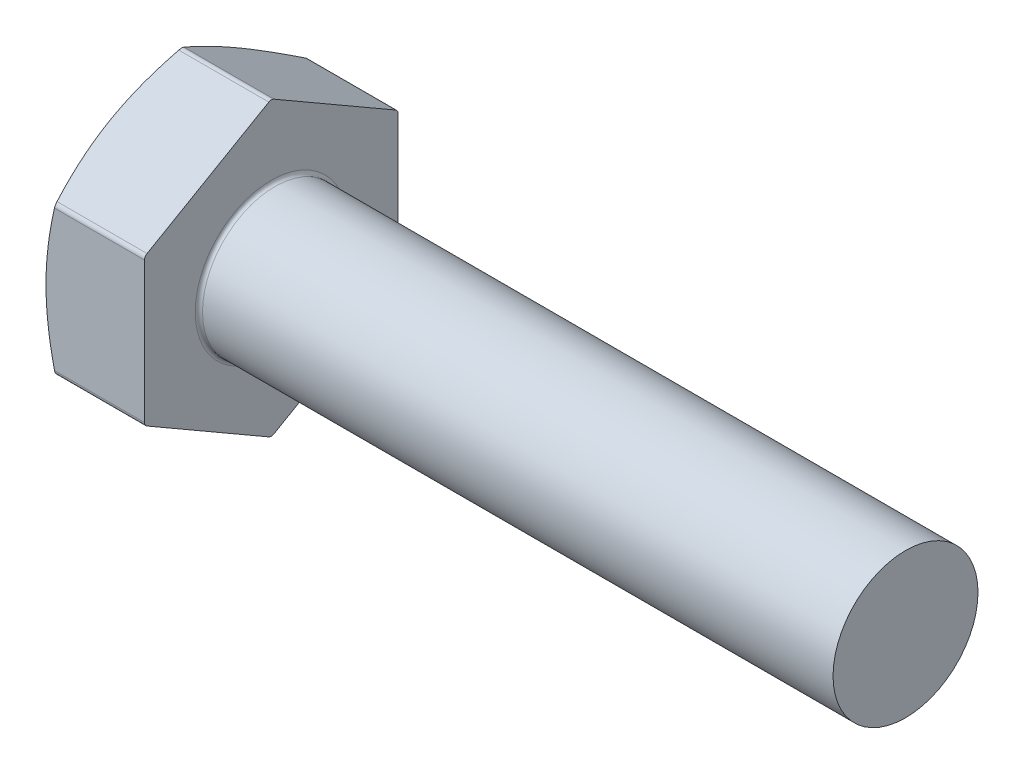
ISO-10303-21;
HEADER;
FILE_DESCRIPTION(('STEP AP214'),'2;1');
FILE_NAME('part.step','',(''),(''),'','','');
FILE_SCHEMA(('AUTOMOTIVE_DESIGN { 1 0 10303 214 1 1 1 1 }'));
ENDSEC;
DATA;
#1=APPLICATION_CONTEXT('core data for automotive mechanical design processes');
#2=APPLICATION_PROTOCOL_DEFINITION('international standard','automotive_design',2000,#1);
#3=PRODUCT_CONTEXT('',#1,'mechanical');
#4=PRODUCT('Part','Part','',(#3));
#5=PRODUCT_RELATED_PRODUCT_CATEGORY('part','',(#4));
#6=PRODUCT_DEFINITION_FORMATION('','',#4);
#7=PRODUCT_DEFINITION_CONTEXT('part definition',#1,'design');
#8=PRODUCT_DEFINITION('design','',#6,#7);
#9=PRODUCT_DEFINITION_SHAPE('','',#8);
#10=(LENGTH_UNIT() NAMED_UNIT(*) SI_UNIT(.MILLI.,.METRE.));
#11=(NAMED_UNIT(*) PLANE_ANGLE_UNIT() SI_UNIT($,.RADIAN.));
#12=(NAMED_UNIT(*) SI_UNIT($,.STERADIAN.) SOLID_ANGLE_UNIT());
#13=UNCERTAINTY_MEASURE_WITH_UNIT(LENGTH_MEASURE(1.E-05),#10,'distance_accuracy_value','');
#14=(GEOMETRIC_REPRESENTATION_CONTEXT(3) GLOBAL_UNCERTAINTY_ASSIGNED_CONTEXT((#13)) GLOBAL_UNIT_ASSIGNED_CONTEXT((#10,
#11,#12)) REPRESENTATION_CONTEXT('',''));
#15=CARTESIAN_POINT('',(0.,0.,0.));
#16=DIRECTION('',(0.,0.,1.));
#17=DIRECTION('',(1.,0.,0.));
#18=AXIS2_PLACEMENT_3D('',#15,#16,#17);
#19=CARTESIAN_POINT('',(60.,0.,0.));
#20=DIRECTION('',(-1.,0.,0.));
#21=DIRECTION('',(0.,0.,1.));
#22=AXIS2_PLACEMENT_3D('',#19,#20,#21);
#23=CYLINDRICAL_SURFACE('',#22,2.);
#24=CARTESIAN_POINT('',(0.100000000000003,0.,0.));
#25=DIRECTION('',(-1.,0.,0.));
#26=DIRECTION('',(0.,0.,1.));
#27=AXIS2_PLACEMENT_3D('',#24,#25,#26);
#28=CIRCLE('',#27,2.);
#29=CARTESIAN_POINT('',(0.100000000000003,0.,2.));
#30=VERTEX_POINT('',#29);
#31=EDGE_CURVE('E12',#30,#30,#28,.F.);
#32=ORIENTED_EDGE('',*,*,#31,.T.);
#33=EDGE_LOOP('',(#32));
#34=FACE_BOUND('',#33,.T.);
#35=CARTESIAN_POINT('',(17.5,0.,0.));
#36=DIRECTION('',(1.,0.,0.));
#37=DIRECTION('',(0.,0.,-1.));
#38=AXIS2_PLACEMENT_3D('',#35,#36,#37);
#39=CIRCLE('',#38,2.);
#40=CARTESIAN_POINT('',(17.5,0.,-2.));
#41=VERTEX_POINT('',#40);
#42=EDGE_CURVE('E309',#41,#41,#39,.T.);
#43=ORIENTED_EDGE('',*,*,#42,.F.);
#44=EDGE_LOOP('',(#43));
#45=FACE_BOUND('',#44,.T.);
#46=ADVANCED_FACE('F40',(#34,#45),#23,.T.);
#47=CARTESIAN_POINT('',(-2.8,2.02072594216369,3.5));
#48=DIRECTION('',(0.,-0.866025403784439,-0.5));
#49=DIRECTION('',(0.,0.5,-0.866025403784439));
#50=AXIS2_PLACEMENT_3D('',#47,#48,#49);
#51=PLANE('',#50);
#52=DIRECTION('',(0.,0.5,-0.866025403784439));
#53=VECTOR('',#52,1.);
#54=CARTESIAN_POINT('',(0.,2.02072594216369,3.5));
#55=LINE('',#54,#53);
#56=CARTESIAN_POINT('',(0.,2.06114046100696,3.43));
#57=VERTEX_POINT('',#56);
#58=CARTESIAN_POINT('',(0.,4.00103736548411,0.0700000000000015));
#59=VERTEX_POINT('',#58);
#60=EDGE_CURVE('E258',#57,#59,#55,.T.);
#61=ORIENTED_EDGE('',*,*,#60,.T.);
#62=DIRECTION('',(1.,0.,0.));
#63=VECTOR('',#62,1.);
#64=CARTESIAN_POINT('',(-2.8,4.00103736548411,0.0699999999999998));
#65=LINE('',#64,#63);
#66=CARTESIAN_POINT('',(-2.48447308173447,4.00103736548378,0.0700000000005721));
#67=VERTEX_POINT('',#66);
#68=EDGE_CURVE('E286',#59,#67,#65,.F.);
#69=ORIENTED_EDGE('',*,*,#68,.T.);
#70=CARTESIAN_POINT('',(-2.46585915276062,2.02061047210985,3.5002));
#71=CARTESIAN_POINT('',(-2.49435720330421,2.08172237683272,3.39435107607269));
#72=CARTESIAN_POINT('',(-2.52102527978907,2.14305977702696,3.28811158253207));
#73=CARTESIAN_POINT('',(-2.57006624025615,2.26619488647482,3.07483531677283));
#74=CARTESIAN_POINT('',(-2.59243680031113,2.32799282611283,2.96779814551672));
#75=CARTESIAN_POINT('',(-2.63223398193864,2.45205045894466,2.75292402238527));
#76=CARTESIAN_POINT('',(-2.64965595197225,2.51431053050519,2.64508641515955));
#77=CARTESIAN_POINT('',(-2.67891284459737,2.63914989249766,2.42885829740411));
#78=CARTESIAN_POINT('',(-2.69074881404304,2.70172912089366,2.32046789432379));
#79=CARTESIAN_POINT('',(-2.70817985225303,2.82580298290105,2.1055656614357));
#80=CARTESIAN_POINT('',(-2.7138992432372,2.88729319870679,1.99906148349178));
#81=CARTESIAN_POINT('',(-2.71928805385423,3.01034457988701,1.78593023934611));
#82=CARTESIAN_POINT('',(-2.71895711322359,3.07190574926814,1.67930316620464));
#83=CARTESIAN_POINT('',(-2.71226194731382,3.19488718090371,1.46629307822427));
#84=CARTESIAN_POINT('',(-2.70590334546463,3.25630752101061,1.35990992854096));
#85=CARTESIAN_POINT('',(-2.68742663821943,3.37892378186288,1.14753233491071));
#86=CARTESIAN_POINT('',(-2.67530905672399,3.4401197225119,1.04153785648963));
#87=CARTESIAN_POINT('',(-2.64959234504912,3.54642377302546,0.857413839949795));
#88=CARTESIAN_POINT('',(-2.63718382478458,3.59160553859148,0.779156726413772));
#89=CARTESIAN_POINT('',(-2.60968662380015,3.6817624957083,0.623000296031627));
#90=CARTESIAN_POINT('',(-2.59459805438181,3.72673769575816,0.54510096446471));
#91=CARTESIAN_POINT('',(-2.56185590357441,3.81682907176803,0.389058123891816));
#92=CARTESIAN_POINT('',(-2.54418251998616,3.86194343486688,0.310917754853488));
#93=CARTESIAN_POINT('',(-2.50661976341031,3.95193357178633,0.155050265528923));
#94=CARTESIAN_POINT('',(-2.4867307618899,3.99680938428408,0.0773230782518859));
#95=CARTESIAN_POINT('',(-2.46585915276062,4.04156735438122,-0.000200000000000179));
#96=B_SPLINE_CURVE_WITH_KNOTS('',3,(#70,#71,#72,#73,#74,#75,#76,#77,#78,#79,#80,#81,#82,#83,#84,
#85,#86,#87,#88,#89,#90,#91,#92,#93,#94,#95),.UNSPECIFIED.,.F.,.F.,(4,2,2,2,2,2,2,2,2,2,2,2,4),
(0.,0.376527941460667,0.753258924731065,1.13034286170485,1.50735610251863,1.87655158670366,
2.24576905449206,2.61464240418558,2.98348220349541,3.25707668499803,3.53065980686928,
3.80646078693032,4.08221559600711),.UNSPECIFIED.);
#97=CARTESIAN_POINT('',(-2.48447308173432,2.06114046100696,3.43));
#98=VERTEX_POINT('',#97);
#99=EDGE_CURVE('E250',#98,#67,#96,.T.);
#100=ORIENTED_EDGE('',*,*,#99,.F.);
#101=DIRECTION('',(1.,0.,0.));
#102=VECTOR('',#101,1.);
#103=CARTESIAN_POINT('',(-2.8,2.06114046100696,3.43));
#104=LINE('',#103,#102);
#105=EDGE_CURVE('E289',#98,#57,#104,.T.);
#106=ORIENTED_EDGE('',*,*,#105,.T.);
#107=EDGE_LOOP('',(#61,#69,#100,#106));
#108=FACE_BOUND('',#107,.T.);
#109=ADVANCED_FACE('F240',(#108),#51,.F.);
#110=CARTESIAN_POINT('',(-2.8,4.04145188432738,0.));
#111=DIRECTION('',(0.,-0.866025403784439,0.5));
#112=DIRECTION('',(0.,-0.5,-0.866025403784439));
#113=AXIS2_PLACEMENT_3D('',#110,#111,#112);
#114=PLANE('',#113);
#115=DIRECTION('',(0.,-0.5,-0.866025403784439));
#116=VECTOR('',#115,1.);
#117=CARTESIAN_POINT('',(0.,4.04145188432738,0.));
#118=LINE('',#117,#116);
#119=CARTESIAN_POINT('',(0.,4.00103736548411,-0.0700000000000001));
#120=VERTEX_POINT('',#119);
#121=CARTESIAN_POINT('',(0.,2.06114046100696,-3.43));
#122=VERTEX_POINT('',#121);
#123=EDGE_CURVE('E267',#120,#122,#118,.T.);
#124=ORIENTED_EDGE('',*,*,#123,.T.);
#125=DIRECTION('',(1.,0.,0.));
#126=VECTOR('',#125,1.);
#127=CARTESIAN_POINT('',(-2.8,2.06114046100696,-3.43));
#128=LINE('',#127,#126);
#129=CARTESIAN_POINT('',(-2.48447308173447,2.06114046100729,-3.42999999999943));
#130=VERTEX_POINT('',#129);
#131=EDGE_CURVE('E360',#122,#130,#128,.F.);
#132=ORIENTED_EDGE('',*,*,#131,.T.);
#133=CARTESIAN_POINT('',(-2.46585915276062,4.04156735438122,0.000199999999999946));
#134=CARTESIAN_POINT('',(-2.49435720330421,3.98045544965835,-0.105648923927311));
#135=CARTESIAN_POINT('',(-2.52102527978907,3.91911804946411,-0.21188841746793));
#136=CARTESIAN_POINT('',(-2.57006624025615,3.79598294001625,-0.425164683227171));
#137=CARTESIAN_POINT('',(-2.59243680031113,3.73418500037824,-0.532201854483278));
#138=CARTESIAN_POINT('',(-2.63223398193864,3.61012736754641,-0.747075977614734));
#139=CARTESIAN_POINT('',(-2.64965595197225,3.54786729598588,-0.854913584840449));
#140=CARTESIAN_POINT('',(-2.67891284459737,3.42302793399341,-1.07114170259589));
#141=CARTESIAN_POINT('',(-2.69074881404304,3.36044870559741,-1.17953210567621));
#142=CARTESIAN_POINT('',(-2.70817985225303,3.23637484359003,-1.3944343385643));
#143=CARTESIAN_POINT('',(-2.7138992432372,3.17488462778428,-1.50093851650822));
#144=CARTESIAN_POINT('',(-2.71928805385423,3.05183324660406,-1.71406976065389));
#145=CARTESIAN_POINT('',(-2.71895711322359,2.99027207722293,-1.82069683379536));
#146=CARTESIAN_POINT('',(-2.71226194731382,2.86729064558736,-2.03370692177573));
#147=CARTESIAN_POINT('',(-2.70590334546463,2.80587030548046,-2.14009007145904));
#148=CARTESIAN_POINT('',(-2.68742663821944,2.68325404462819,-2.35246766508929));
#149=CARTESIAN_POINT('',(-2.67530905672399,2.62205810397917,-2.45846214351036));
#150=CARTESIAN_POINT('',(-2.64959234504912,2.51575405346561,-2.6425861600502));
#151=CARTESIAN_POINT('',(-2.63718382478458,2.47057228789959,-2.72084327358623));
#152=CARTESIAN_POINT('',(-2.60968662380015,2.38041533078277,-2.87699970396837));
#153=CARTESIAN_POINT('',(-2.59459805438181,2.33544013073292,-2.95489903553529));
#154=CARTESIAN_POINT('',(-2.56185590357441,2.24534875472304,-3.11094187610818));
#155=CARTESIAN_POINT('',(-2.54418251998616,2.20023439162419,-3.18908224514651));
#156=CARTESIAN_POINT('',(-2.50661976341031,2.11024425470474,-3.34494973447108));
#157=CARTESIAN_POINT('',(-2.4867307618899,2.06536844220699,-3.42267692174811));
#158=CARTESIAN_POINT('',(-2.46585915276062,2.02061047210985,-3.5002));
#159=B_SPLINE_CURVE_WITH_KNOTS('',3,(#133,#134,#135,#136,#137,#138,#139,#140,#141,#142,#143,
#144,#145,#146,#147,#148,#149,#150,#151,#152,#153,#154,#155,#156,#157,#158),.UNSPECIFIED.,.F.,
.F.,(4,2,2,2,2,2,2,2,2,2,2,2,4),(0.,0.376527941460667,0.753258924731066,1.13034286170485,
1.50735610251863,1.87655158670366,2.24576905449206,2.61464240418558,2.98348220349541,
3.25707668499803,3.53065980686928,3.80646078693033,4.08221559600712),.UNSPECIFIED.);
#160=CARTESIAN_POINT('',(-2.48447308173432,4.00103736548411,-0.0700000000000002));
#161=VERTEX_POINT('',#160);
#162=EDGE_CURVE('E259',#161,#130,#159,.T.);
#163=ORIENTED_EDGE('',*,*,#162,.F.);
#164=DIRECTION('',(1.,0.,0.));
#165=VECTOR('',#164,1.);
#166=CARTESIAN_POINT('',(-2.8,4.00103736548411,-0.0700000000000001));
#167=LINE('',#166,#165);
#168=EDGE_CURVE('E365',#161,#120,#167,.T.);
#169=ORIENTED_EDGE('',*,*,#168,.T.);
#170=EDGE_LOOP('',(#124,#132,#163,#169));
#171=FACE_BOUND('',#170,.T.);
#172=ADVANCED_FACE('F245',(#171),#114,.F.);
#173=CARTESIAN_POINT('',(-2.8,2.02072594216369,-3.5));
#174=DIRECTION('',(0.,0.,1.));
#175=DIRECTION('',(0.,-1.,0.));
#176=AXIS2_PLACEMENT_3D('',#173,#174,#175);
#177=PLANE('',#176);
#178=DIRECTION('',(0.,-1.,0.));
#179=VECTOR('',#178,1.);
#180=CARTESIAN_POINT('',(0.,2.02072594216369,-3.5));
#181=LINE('',#180,#179);
#182=CARTESIAN_POINT('',(0.,1.93989690447714,-3.5));
#183=VERTEX_POINT('',#182);
#184=CARTESIAN_POINT('',(0.,-1.93989690447714,-3.5));
#185=VERTEX_POINT('',#184);
#186=EDGE_CURVE('E270',#183,#185,#181,.T.);
#187=ORIENTED_EDGE('',*,*,#186,.T.);
#188=DIRECTION('',(1.,0.,0.));
#189=VECTOR('',#188,1.);
#190=CARTESIAN_POINT('',(-2.8,-1.93989690447714,-3.5));
#191=LINE('',#190,#189);
#192=CARTESIAN_POINT('',(-2.48447308173432,-1.93989690447714,-3.5));
#193=VERTEX_POINT('',#192);
#194=EDGE_CURVE('E364',#185,#193,#191,.F.);
#195=ORIENTED_EDGE('',*,*,#194,.T.);
#196=CARTESIAN_POINT('',(-1.32100633349475,-5.47332337813791,-3.5));
#197=CARTESIAN_POINT('',(-1.38336525145743,-5.31454546120619,-3.5));
#198=CARTESIAN_POINT('',(-1.44507234656034,-5.1555069251168,-3.5));
#199=CARTESIAN_POINT('',(-1.5668111673363,-4.83677523361074,-3.5));
#200=CARTESIAN_POINT('',(-1.62684275073955,-4.67708202391734,-3.5));
#201=CARTESIAN_POINT('',(-1.74502799389888,-4.35644650093455,-3.5));
#202=CARTESIAN_POINT('',(-1.80317537146743,-4.19550186390653,-3.5));
#203=CARTESIAN_POINT('',(-1.91687564710078,-3.87269502020751,-3.5));
#204=CARTESIAN_POINT('',(-1.97242853941524,-3.71083281150372,-3.5));
#205=CARTESIAN_POINT('',(-2.07941866422775,-3.38856078400984,-3.5));
#206=CARTESIAN_POINT('',(-2.13090673408788,-3.22816792990599,-3.5));
#207=CARTESIAN_POINT('',(-2.22987237828365,-2.90615249132493,-3.5));
#208=CARTESIAN_POINT('',(-2.27735018156085,-2.74452997762259,-3.5));
#209=CARTESIAN_POINT('',(-2.36718655860079,-2.42001829020189,-3.5));
#210=CARTESIAN_POINT('',(-2.40954999256595,-2.25713047813531,-3.5));
#211=CARTESIAN_POINT('',(-2.48790915336851,-1.92977581610914,-3.5));
#212=CARTESIAN_POINT('',(-2.52390299469217,-1.7653085137308,-3.5));
#213=CARTESIAN_POINT('',(-2.5998124160193,-1.37369049681621,-3.5));
#214=CARTESIAN_POINT('',(-2.63626315550615,-1.14583217939736,-3.5));
#215=CARTESIAN_POINT('',(-2.67684855043411,-0.80245170627022,-3.5));
#216=CARTESIAN_POINT('',(-2.68802793449828,-0.6877435918983,-3.5));
#217=CARTESIAN_POINT('',(-2.70533306868503,-0.457951592195634,-3.5));
#218=CARTESIAN_POINT('',(-2.71145941952129,-0.34286775316528,-3.5));
#219=CARTESIAN_POINT('',(-2.71845360465395,-0.11183643850944,-3.5));
#220=CARTESIAN_POINT('',(-2.71928912033619,0.00411202164055741,-3.5));
#221=CARTESIAN_POINT('',(-2.71558474511865,0.235918939238521,-3.5));
#222=CARTESIAN_POINT('',(-2.71104499290419,0.351777398931383,-3.5));
#223=CARTESIAN_POINT('',(-2.69675940446445,0.583194078653194,-3.5));
#224=CARTESIAN_POINT('',(-2.68701250411305,0.698752232459826,-3.5));
#225=CARTESIAN_POINT('',(-2.66265524084536,0.92933205697672,-3.5));
#226=CARTESIAN_POINT('',(-2.64804540691725,1.04435378465985,-3.5));
#227=CARTESIAN_POINT('',(-2.57287454619112,1.55717230002804,-3.5));
#228=CARTESIAN_POINT('',(-2.48796806886785,1.95146038373873,-3.5));
#229=CARTESIAN_POINT('',(-2.33633314517701,2.53633288984111,-3.5));
#230=CARTESIAN_POINT('',(-2.28166216486293,2.73042578551327,-3.5));
#231=CARTESIAN_POINT('',(-2.16616302036065,3.11678273817431,-3.5));
#232=CARTESIAN_POINT('',(-2.10533572123528,3.30904704796718,-3.5));
#233=CARTESIAN_POINT('',(-1.97850555951288,3.69366513948681,-3.5));
#234=CARTESIAN_POINT('',(-1.91246273002805,3.88600550519339,-3.5));
#235=CARTESIAN_POINT('',(-1.77679346480294,4.26942072425074,-3.5));
#236=CARTESIAN_POINT('',(-1.70716695093892,4.46049554991036,-3.5));
#237=CARTESIAN_POINT('',(-1.56523403364987,4.8414256275756,-3.5));
#238=CARTESIAN_POINT('',(-1.49293036872617,5.03128190480489,-3.5));
#239=CARTESIAN_POINT('',(-1.34617754735182,5.41016485264392,-3.5));
#240=CARTESIAN_POINT('',(-1.27172835662194,5.59919150994308,-3.5));
#241=CARTESIAN_POINT('',(-1.04624323515366,6.16431801981198,-3.5));
#242=CARTESIAN_POINT('',(-0.892708182703138,6.53941954049077,-3.5));
#243=CARTESIAN_POINT('',(-0.581290168373941,7.28792347113465,-3.5));
#244=CARTESIAN_POINT('',(-0.423406007967022,7.66132537900782,-3.5));
#245=CARTESIAN_POINT('',(-0.107537463651079,8.40019296430014,-3.5));
#246=CARTESIAN_POINT('',(0.0503945439909416,8.76568106363534,-3.5));
#247=CARTESIAN_POINT('',(0.288789637834115,9.31318654656532,-3.5));
#248=CARTESIAN_POINT('',(0.368490668223535,9.49553669123051,-3.5));
#249=CARTESIAN_POINT('',(0.528331580760165,9.86004375061248,-3.5));
#250=CARTESIAN_POINT('',(0.608471461249065,10.0422006660563,-3.5));
#251=CARTESIAN_POINT('',(0.688796702796817,10.2242758614,-3.5));
#252=B_SPLINE_CURVE_WITH_KNOTS('',3,(#196,#197,#198,#199,#200,#201,#202,#203,#204,#205,#206,
#207,#208,#209,#210,#211,#212,#213,#214,#215,#216,#217,#218,#219,#220,#221,#222,#223,#224,#225,
#226,#227,#228,#229,#230,#231,#232,#233,#234,#235,#236,#237,#238,#239,#240,#241,#242,#243,#244,
#245,#246,#247,#248,#249,#250,#251),.UNSPECIFIED.,.F.,.F.,(4,2,2,2,2,2,2,2,2,2,2,2,2,2,2,2,2,2,
2,2,2,2,2,2,2,2,2,4),(0.,0.511758406715346,1.02356013608727,1.53692196590774,2.05028493347519,
2.55560654588075,3.0608992905247,3.56570800954206,4.07066591194245,4.76219851808089,
5.10785983858493,5.45348006032384,5.80120945335057,6.14892987493316,6.49672138341181,
6.84447507161213,8.05145689765206,8.65639956225731,9.26125734029584,9.87131042615079,
10.481376816704,11.090835524704,11.7003039754791,12.9161775628887,14.1323896410142,
15.3268326641363,15.9238536225229,16.5208723264662),.UNSPECIFIED.);
#253=CARTESIAN_POINT('',(-2.48447308173459,1.93989690447595,-3.5));
#254=VERTEX_POINT('',#253);
#255=EDGE_CURVE('E342',#254,#193,#252,.F.);
#256=ORIENTED_EDGE('',*,*,#255,.F.);
#257=DIRECTION('',(1.,0.,0.));
#258=VECTOR('',#257,1.);
#259=CARTESIAN_POINT('',(-2.8,1.93989690447714,-3.5));
#260=LINE('',#259,#258);
#261=EDGE_CURVE('E139',#254,#183,#260,.T.);
#262=ORIENTED_EDGE('',*,*,#261,.T.);
#263=EDGE_LOOP('',(#187,#195,#256,#262));
#264=FACE_BOUND('',#263,.T.);
#265=ADVANCED_FACE('F335',(#264),#177,.F.);
#266=CARTESIAN_POINT('',(-2.8,-2.02072594216369,-3.5));
#267=DIRECTION('',(0.,0.866025403784439,0.5));
#268=DIRECTION('',(0.,-0.5,0.866025403784439));
#269=AXIS2_PLACEMENT_3D('',#266,#267,#268);
#270=PLANE('',#269);
#271=DIRECTION('',(0.,-0.5,0.866025403784439));
#272=VECTOR('',#271,1.);
#273=CARTESIAN_POINT('',(0.,-2.02072594216369,-3.5));
#274=LINE('',#273,#272);
#275=CARTESIAN_POINT('',(0.,-2.06114046100696,-3.43));
#276=VERTEX_POINT('',#275);
#277=CARTESIAN_POINT('',(0.,-4.00103736548411,-0.0700000000000002));
#278=VERTEX_POINT('',#277);
#279=EDGE_CURVE('E273',#276,#278,#274,.T.);
#280=ORIENTED_EDGE('',*,*,#279,.T.);
#281=DIRECTION('',(1.,0.,0.));
#282=VECTOR('',#281,1.);
#283=CARTESIAN_POINT('',(-2.8,-4.00103736548411,-0.0699999999999998));
#284=LINE('',#283,#282);
#285=CARTESIAN_POINT('',(-2.48447308173447,-4.00103736548378,-0.0700000000005702));
#286=VERTEX_POINT('',#285);
#287=EDGE_CURVE('E173',#278,#286,#284,.F.);
#288=ORIENTED_EDGE('',*,*,#287,.T.);
#289=CARTESIAN_POINT('',(-2.46585915276062,-2.02061047210985,-3.5002));
#290=CARTESIAN_POINT('',(-2.49435720330421,-2.08172237683272,-3.39435107607269));
#291=CARTESIAN_POINT('',(-2.52102527978907,-2.14305977702696,-3.28811158253207));
#292=CARTESIAN_POINT('',(-2.57006624025615,-2.26619488647482,-3.07483531677283));
#293=CARTESIAN_POINT('',(-2.59243680031113,-2.32799282611283,-2.96779814551672));
#294=CARTESIAN_POINT('',(-2.63223398193864,-2.45205045894466,-2.75292402238526));
#295=CARTESIAN_POINT('',(-2.64965595197225,-2.51431053050519,-2.64508641515955));
#296=CARTESIAN_POINT('',(-2.67891284459737,-2.63914989249766,-2.42885829740411));
#297=CARTESIAN_POINT('',(-2.69074881404304,-2.70172912089366,-2.32046789432379));
#298=CARTESIAN_POINT('',(-2.70817985225303,-2.82580298290105,-2.1055656614357));
#299=CARTESIAN_POINT('',(-2.7138992432372,-2.88729319870679,-1.99906148349178));
#300=CARTESIAN_POINT('',(-2.71928805385423,-3.01034457988701,-1.78593023934611));
#301=CARTESIAN_POINT('',(-2.71895711322359,-3.07190574926814,-1.67930316620464));
#302=CARTESIAN_POINT('',(-2.71226194731382,-3.19488718090371,-1.46629307822427));
#303=CARTESIAN_POINT('',(-2.70590334546463,-3.25630752101061,-1.35990992854096));
#304=CARTESIAN_POINT('',(-2.68742663821944,-3.37892378186288,-1.14753233491071));
#305=CARTESIAN_POINT('',(-2.67530905672399,-3.4401197225119,-1.04153785648963));
#306=CARTESIAN_POINT('',(-2.64959234504912,-3.54642377302546,-0.857413839949794));
#307=CARTESIAN_POINT('',(-2.63718382478458,-3.59160553859148,-0.779156726413771));
#308=CARTESIAN_POINT('',(-2.60968662380015,-3.6817624957083,-0.623000296031626));
#309=CARTESIAN_POINT('',(-2.59459805438181,-3.72673769575816,-0.545100964464709));
#310=CARTESIAN_POINT('',(-2.56185590357441,-3.81682907176803,-0.389058123891815));
#311=CARTESIAN_POINT('',(-2.54418251998616,-3.86194343486688,-0.310917754853488));
#312=CARTESIAN_POINT('',(-2.50661976341031,-3.95193357178633,-0.155050265528922));
#313=CARTESIAN_POINT('',(-2.4867307618899,-3.99680938428408,-0.0773230782518856));
#314=CARTESIAN_POINT('',(-2.46585915276062,-4.04156735438122,0.000200000000000553));
#315=B_SPLINE_CURVE_WITH_KNOTS('',3,(#289,#290,#291,#292,#293,#294,#295,#296,#297,#298,#299,
#300,#301,#302,#303,#304,#305,#306,#307,#308,#309,#310,#311,#312,#313,#314),.UNSPECIFIED.,.F.,
.F.,(4,2,2,2,2,2,2,2,2,2,2,2,4),(0.,0.376527941460667,0.753258924731067,1.13034286170485,
1.50735610251863,1.87655158670367,2.24576905449206,2.61464240418558,2.98348220349541,
3.25707668499803,3.53065980686928,3.80646078693033,4.08221559600711),.UNSPECIFIED.);
#316=CARTESIAN_POINT('',(-2.48447308173432,-2.06114046100696,-3.43));
#317=VERTEX_POINT('',#316);
#318=EDGE_CURVE('E135',#317,#286,#315,.T.);
#319=ORIENTED_EDGE('',*,*,#318,.F.);
#320=DIRECTION('',(1.,0.,0.));
#321=VECTOR('',#320,1.);
#322=CARTESIAN_POINT('',(-2.8,-2.06114046100696,-3.43));
#323=LINE('',#322,#321);
#324=EDGE_CURVE('E170',#317,#276,#323,.T.);
#325=ORIENTED_EDGE('',*,*,#324,.T.);
#326=EDGE_LOOP('',(#280,#288,#319,#325));
#327=FACE_BOUND('',#326,.T.);
#328=ADVANCED_FACE('F332',(#327),#270,.F.);
#329=CARTESIAN_POINT('',(-2.8,-4.04145188432738,0.));
#330=DIRECTION('',(0.,0.866025403784439,-0.5));
#331=DIRECTION('',(0.,0.5,0.866025403784439));
#332=AXIS2_PLACEMENT_3D('',#329,#330,#331);
#333=PLANE('',#332);
#334=CARTESIAN_POINT('',(-2.46585915276062,-4.04156735438122,-0.000199999999999928));
#335=CARTESIAN_POINT('',(-2.49435720330421,-3.98045544965835,0.105648923927312));
#336=CARTESIAN_POINT('',(-2.52102527978907,-3.91911804946411,0.21188841746793));
#337=CARTESIAN_POINT('',(-2.57006624025615,-3.79598294001625,0.425164683227171));
#338=CARTESIAN_POINT('',(-2.59243680031113,-3.73418500037824,0.532201854483279));
#339=CARTESIAN_POINT('',(-2.63223398193864,-3.61012736754641,0.747075977614734));
#340=CARTESIAN_POINT('',(-2.64965595197225,-3.54786729598588,0.854913584840449));
#341=CARTESIAN_POINT('',(-2.67891284459737,-3.42302793399341,1.07114170259589));
#342=CARTESIAN_POINT('',(-2.69074881404304,-3.36044870559741,1.17953210567621));
#343=CARTESIAN_POINT('',(-2.70817985225303,-3.23637484359003,1.3944343385643));
#344=CARTESIAN_POINT('',(-2.7138992432372,-3.17488462778428,1.50093851650822));
#345=CARTESIAN_POINT('',(-2.71928805385423,-3.05183324660406,1.71406976065389));
#346=CARTESIAN_POINT('',(-2.71895711322359,-2.99027207722293,1.82069683379536));
#347=CARTESIAN_POINT('',(-2.71226194731382,-2.86729064558736,2.03370692177573));
#348=CARTESIAN_POINT('',(-2.70590334546463,-2.80587030548046,2.14009007145904));
#349=CARTESIAN_POINT('',(-2.68742663821943,-2.68325404462819,2.35246766508929));
#350=CARTESIAN_POINT('',(-2.67530905672399,-2.62205810397917,2.45846214351037));
#351=CARTESIAN_POINT('',(-2.64959234504912,-2.51575405346562,2.6425861600502));
#352=CARTESIAN_POINT('',(-2.63718382478458,-2.47057228789959,2.72084327358623));
#353=CARTESIAN_POINT('',(-2.60968662380015,-2.38041533078277,2.87699970396837));
#354=CARTESIAN_POINT('',(-2.5945980543818,-2.33544013073292,2.95489903553529));
#355=CARTESIAN_POINT('',(-2.56185590357441,-2.24534875472304,3.11094187610818));
#356=CARTESIAN_POINT('',(-2.54418251998616,-2.20023439162419,3.18908224514651));
#357=CARTESIAN_POINT('',(-2.50661976341031,-2.11024425470474,3.34494973447108));
#358=CARTESIAN_POINT('',(-2.4867307618899,-2.06536844220699,3.42267692174812));
#359=CARTESIAN_POINT('',(-2.46585915276062,-2.02061047210985,3.5002));
#360=B_SPLINE_CURVE_WITH_KNOTS('',3,(#334,#335,#336,#337,#338,#339,#340,#341,#342,#343,#344,
#345,#346,#347,#348,#349,#350,#351,#352,#353,#354,#355,#356,#357,#358,#359),.UNSPECIFIED.,.F.,
.F.,(4,2,2,2,2,2,2,2,2,2,2,2,4),(0.,0.376527941460667,0.753258924731065,1.13034286170485,
1.50735610251863,1.87655158670366,2.24576905449206,2.61464240418558,2.98348220349541,
3.25707668499803,3.53065980686928,3.80646078693032,4.08221559600712),.UNSPECIFIED.);
#361=CARTESIAN_POINT('',(-2.48447308173432,-4.00103736548411,0.0700000000000004));
#362=VERTEX_POINT('',#361);
#363=CARTESIAN_POINT('',(-2.48447308173447,-2.06114046100729,3.42999999999943));
#364=VERTEX_POINT('',#363);
#365=EDGE_CURVE('E133',#362,#364,#360,.T.);
#366=ORIENTED_EDGE('',*,*,#365,.F.);
#367=DIRECTION('',(1.,0.,0.));
#368=VECTOR('',#367,1.);
#369=CARTESIAN_POINT('',(-2.8,-4.00103736548411,0.0700000000000003));
#370=LINE('',#369,#368);
#371=CARTESIAN_POINT('',(0.,-4.00103736548411,0.0700000000000002));
#372=VERTEX_POINT('',#371);
#373=EDGE_CURVE('E146',#362,#372,#370,.T.);
#374=ORIENTED_EDGE('',*,*,#373,.T.);
#375=DIRECTION('',(0.,0.5,0.866025403784439));
#376=VECTOR('',#375,1.);
#377=CARTESIAN_POINT('',(0.,-4.04145188432738,0.));
#378=LINE('',#377,#376);
#379=CARTESIAN_POINT('',(0.,-2.06114046100696,3.43));
#380=VERTEX_POINT('',#379);
#381=EDGE_CURVE('E276',#372,#380,#378,.T.);
#382=ORIENTED_EDGE('',*,*,#381,.T.);
#383=DIRECTION('',(1.,0.,0.));
#384=VECTOR('',#383,1.);
#385=CARTESIAN_POINT('',(-2.8,-2.06114046100696,3.43));
#386=LINE('',#385,#384);
#387=EDGE_CURVE('E149',#380,#364,#386,.F.);
#388=ORIENTED_EDGE('',*,*,#387,.T.);
#389=EDGE_LOOP('',(#366,#374,#382,#388));
#390=FACE_BOUND('',#389,.T.);
#391=ADVANCED_FACE('F144',(#390),#333,.F.);
#392=CARTESIAN_POINT('',(-2.8,-2.02072594216369,3.5));
#393=DIRECTION('',(0.,0.,-1.));
#394=DIRECTION('',(0.,1.,0.));
#395=AXIS2_PLACEMENT_3D('',#392,#393,#394);
#396=PLANE('',#395);
#397=CARTESIAN_POINT('',(-1.32100633286343,-5.47332337974492,3.5));
#398=CARTESIAN_POINT('',(-1.38336525085479,-5.31454546275369,3.5));
#399=CARTESIAN_POINT('',(-1.44507234598633,-5.15550692660475,3.5));
#400=CARTESIAN_POINT('',(-1.5668111668193,-4.83677523497944,3.5));
#401=CARTESIAN_POINT('',(-1.62684275025093,-4.67708202522632,3.5));
#402=CARTESIAN_POINT('',(-1.74502799346685,-4.35644650212328,3.5));
#403=CARTESIAN_POINT('',(-1.80317537106359,-4.19550186503473,3.5));
#404=CARTESIAN_POINT('',(-1.91687564675263,-3.87269502121429,3.5));
#405=CARTESIAN_POINT('',(-1.97242853909458,-3.71083281244962,3.5));
#406=CARTESIAN_POINT('',(-2.07941866396065,-3.38856078483404,3.5));
#407=CARTESIAN_POINT('',(-2.13090673384685,-3.22816793066939,3.5));
#408=CARTESIAN_POINT('',(-2.22987237809303,-2.90615249196603,3.5));
#409=CARTESIAN_POINT('',(-2.27735018139456,-2.7445299782022,3.5));
#410=CARTESIAN_POINT('',(-2.3671865584804,-2.42001829065781,3.5));
#411=CARTESIAN_POINT('',(-2.40954999246714,-2.25713047852906,3.5));
#412=CARTESIAN_POINT('',(-2.48790915330887,-1.92977581637738,3.5));
#413=CARTESIAN_POINT('',(-2.52390299465011,-1.76530851393572,3.5));
#414=CARTESIAN_POINT('',(-2.59981241598952,-1.37369049698631,3.5));
#415=CARTESIAN_POINT('',(-2.63626315547623,-1.145832179597,3.5));
#416=CARTESIAN_POINT('',(-2.67684855040843,-0.802451706514275,3.5));
#417=CARTESIAN_POINT('',(-2.68802793447476,-0.68774359215718,3.5));
#418=CARTESIAN_POINT('',(-2.70533306866733,-0.457951592484098,3.5));
#419=CARTESIAN_POINT('',(-2.71145941950726,-0.342867753468506,3.5));
#420=CARTESIAN_POINT('',(-2.71845360464873,-0.111836438842684,3.5));
#421=CARTESIAN_POINT('',(-2.71928912033615,0.00411202129205645,3.5));
#422=CARTESIAN_POINT('',(-2.7155847451303,0.235918938859797,3.5));
#423=CARTESIAN_POINT('',(-2.71104499292237,0.351777398537693,3.5));
#424=CARTESIAN_POINT('',(-2.69675940449672,0.583194078229811,3.5));
#425=CARTESIAN_POINT('',(-2.6870125041529,0.698752232021716,3.5));
#426=CARTESIAN_POINT('',(-2.66265524090114,0.929332056509503,3.5));
#427=CARTESIAN_POINT('',(-2.64804540698138,1.04435378417826,3.5));
#428=CARTESIAN_POINT('',(-2.57287454628645,1.55717229953091,3.5));
#429=CARTESIAN_POINT('',(-2.48796806898191,1.95146038324128,3.5));
#430=CARTESIAN_POINT('',(-2.33633314531371,2.53633288934264,3.5));
#431=CARTESIAN_POINT('',(-2.28166216500624,2.73042578501445,3.5));
#432=CARTESIAN_POINT('',(-2.16616302051585,3.11678273767457,3.5));
#433=CARTESIAN_POINT('',(-2.10533572139574,3.30904704746687,3.5));
#434=CARTESIAN_POINT('',(-1.97850555968264,3.69366513898584,3.5));
#435=CARTESIAN_POINT('',(-1.91246273020181,3.88600550469232,3.5));
#436=CARTESIAN_POINT('',(-1.77679346498392,4.26942072374927,3.5));
#437=CARTESIAN_POINT('',(-1.70716695112312,4.46049554940857,3.5));
#438=CARTESIAN_POINT('',(-1.56523403383993,4.84142562707295,3.5));
#439=CARTESIAN_POINT('',(-1.49293036891887,5.03128190430169,3.5));
#440=CARTESIAN_POINT('',(-1.34617754754939,5.41016485213948,3.5));
#441=CARTESIAN_POINT('',(-1.27172835682174,5.59919150943795,3.5));
#442=CARTESIAN_POINT('',(-1.04624323535367,6.16431801931955,3.5));
#443=CARTESIAN_POINT('',(-0.892708182900412,6.53941954001145,3.5));
#444=CARTESIAN_POINT('',(-0.581290168564733,7.2879234706812,3.5));
#445=CARTESIAN_POINT('',(-0.423406008154071,7.66132537856711,3.5));
#446=CARTESIAN_POINT('',(-0.107537463831354,8.40019296388156,3.5));
#447=CARTESIAN_POINT('',(0.0503945438136631,8.76568106322615,3.5));
#448=CARTESIAN_POINT('',(0.288789637661575,9.31318654617008,3.5));
#449=CARTESIAN_POINT('',(0.368490668052611,9.49553669083989,3.5));
#450=CARTESIAN_POINT('',(0.528331580592542,9.86004375023107,3.5));
#451=CARTESIAN_POINT('',(0.608471461083128,10.0422006656795,3.5));
#452=CARTESIAN_POINT('',(0.688796702632594,10.2242758610277,3.5));
#453=B_SPLINE_CURVE_WITH_KNOTS('',3,(#397,#398,#399,#400,#401,#402,#403,#404,#405,#406,#407,
#408,#409,#410,#411,#412,#413,#414,#415,#416,#417,#418,#419,#420,#421,#422,#423,#424,#425,#426,
#427,#428,#429,#430,#431,#432,#433,#434,#435,#436,#437,#438,#439,#440,#441,#442,#443,#444,#445,
#446,#447,#448,#449,#450,#451,#452),.UNSPECIFIED.,.F.,.F.,(4,2,2,2,2,2,2,2,2,2,2,2,2,2,2,2,2,2,
2,2,2,2,2,2,2,2,2,4),(0.,0.511758406912961,1.02356013648252,1.53692196650253,2.05028493426952,
2.55560654687264,3.06089929171414,3.56570801092826,4.07066591352534,4.76219851957661,
5.10785984003706,5.4534800617324,5.80120945471351,6.14892987625051,6.49672138468325,
6.84447507283764,8.05145689886377,8.6563995634626,9.26125734149471,9.87131042734545,
10.4813768178944,11.0908355258901,11.7003039766609,12.9161775641099,14.132389642275,
15.3268326654266,15.9238536238278,16.5208723277857),.UNSPECIFIED.);
#454=CARTESIAN_POINT('',(-2.48447308173432,-1.93989690447714,3.5));
#455=VERTEX_POINT('',#454);
#456=CARTESIAN_POINT('',(-2.48447308173459,1.93989690447595,3.5));
#457=VERTEX_POINT('',#456);
#458=EDGE_CURVE('E150',#455,#457,#453,.T.);
#459=ORIENTED_EDGE('',*,*,#458,.F.);
#460=DIRECTION('',(1.,0.,0.));
#461=VECTOR('',#460,1.);
#462=CARTESIAN_POINT('',(-2.8,-1.93989690447714,3.5));
#463=LINE('',#462,#461);
#464=CARTESIAN_POINT('',(0.,-1.93989690447714,3.5));
#465=VERTEX_POINT('',#464);
#466=EDGE_CURVE('E281',#455,#465,#463,.T.);
#467=ORIENTED_EDGE('',*,*,#466,.T.);
#468=DIRECTION('',(0.,1.,0.));
#469=VECTOR('',#468,1.);
#470=CARTESIAN_POINT('',(0.,-2.02072594216369,3.5));
#471=LINE('',#470,#469);
#472=CARTESIAN_POINT('',(0.,1.93989690447714,3.5));
#473=VERTEX_POINT('',#472);
#474=EDGE_CURVE('E158',#465,#473,#471,.T.);
#475=ORIENTED_EDGE('',*,*,#474,.T.);
#476=DIRECTION('',(1.,0.,0.));
#477=VECTOR('',#476,1.);
#478=CARTESIAN_POINT('',(-2.8,1.93989690447714,3.5));
#479=LINE('',#478,#477);
#480=EDGE_CURVE('E55',#473,#457,#479,.F.);
#481=ORIENTED_EDGE('',*,*,#480,.T.);
#482=EDGE_LOOP('',(#459,#467,#475,#481));
#483=FACE_BOUND('',#482,.T.);
#484=ADVANCED_FACE('F279',(#483),#396,.F.);
#485=CARTESIAN_POINT('',(0.,4.04145188432738,0.));
#486=DIRECTION('',(-1.,0.,0.));
#487=DIRECTION('',(0.,0.,1.));
#488=AXIS2_PLACEMENT_3D('',#485,#486,#487);
#489=PLANE('',#488);
#490=CARTESIAN_POINT('',(0.,0.,0.));
#491=DIRECTION('',(-1.,0.,0.));
#492=DIRECTION('',(0.,0.,1.));
#493=AXIS2_PLACEMENT_3D('',#490,#491,#492);
#494=CIRCLE('',#493,2.1);
#495=CARTESIAN_POINT('',(0.,0.,2.1));
#496=VERTEX_POINT('',#495);
#497=EDGE_CURVE('E48',#496,#496,#494,.T.);
#498=ORIENTED_EDGE('',*,*,#497,.T.);
#499=EDGE_LOOP('',(#498));
#500=FACE_BOUND('',#499,.T.);
#501=ORIENTED_EDGE('',*,*,#381,.F.);
#502=CARTESIAN_POINT('',(0.,-3.87979380895429,0.));
#503=DIRECTION('',(-1.,0.,0.));
#504=DIRECTION('',(0.,0.,1.));
#505=AXIS2_PLACEMENT_3D('',#502,#503,#504);
#506=CIRCLE('',#505,0.14);
#507=EDGE_CURVE('E153',#372,#278,#506,.F.);
#508=ORIENTED_EDGE('',*,*,#507,.T.);
#509=ORIENTED_EDGE('',*,*,#279,.F.);
#510=CARTESIAN_POINT('',(0.,-1.93989690447714,-3.36));
#511=DIRECTION('',(-1.,0.,0.));
#512=DIRECTION('',(0.,0.,1.));
#513=AXIS2_PLACEMENT_3D('',#510,#511,#512);
#514=CIRCLE('',#513,0.14);
#515=EDGE_CURVE('E167',#276,#185,#514,.F.);
#516=ORIENTED_EDGE('',*,*,#515,.T.);
#517=ORIENTED_EDGE('',*,*,#186,.F.);
#518=CARTESIAN_POINT('',(0.,1.93989690447714,-3.36));
#519=DIRECTION('',(-1.,0.,0.));
#520=DIRECTION('',(0.,0.,1.));
#521=AXIS2_PLACEMENT_3D('',#518,#519,#520);
#522=CIRCLE('',#521,0.14);
#523=EDGE_CURVE('E165',#183,#122,#522,.F.);
#524=ORIENTED_EDGE('',*,*,#523,.T.);
#525=ORIENTED_EDGE('',*,*,#123,.F.);
#526=CARTESIAN_POINT('',(0.,3.87979380895429,0.));
#527=DIRECTION('',(-1.,0.,0.));
#528=DIRECTION('',(0.,0.,1.));
#529=AXIS2_PLACEMENT_3D('',#526,#527,#528);
#530=CIRCLE('',#529,0.14);
#531=EDGE_CURVE('E163',#120,#59,#530,.F.);
#532=ORIENTED_EDGE('',*,*,#531,.T.);
#533=ORIENTED_EDGE('',*,*,#60,.F.);
#534=CARTESIAN_POINT('',(0.,1.93989690447714,3.36));
#535=DIRECTION('',(-1.,0.,0.));
#536=DIRECTION('',(0.,0.,1.));
#537=AXIS2_PLACEMENT_3D('',#534,#535,#536);
#538=CIRCLE('',#537,0.14);
#539=EDGE_CURVE('E154',#57,#473,#538,.F.);
#540=ORIENTED_EDGE('',*,*,#539,.T.);
#541=ORIENTED_EDGE('',*,*,#474,.F.);
#542=CARTESIAN_POINT('',(0.,-1.93989690447714,3.36));
#543=DIRECTION('',(-1.,0.,0.));
#544=DIRECTION('',(0.,0.,1.));
#545=AXIS2_PLACEMENT_3D('',#542,#543,#544);
#546=CIRCLE('',#545,0.14);
#547=EDGE_CURVE('E156',#465,#380,#546,.F.);
#548=ORIENTED_EDGE('',*,*,#547,.T.);
#549=EDGE_LOOP('',(#501,#508,#509,#516,#517,#524,#525,#532,#533,#540,#541,#548));
#550=FACE_BOUND('',#549,.T.);
#551=ADVANCED_FACE('F295',(#500,#550),#489,.F.);
#552=CARTESIAN_POINT('',(-2.8,0.,0.));
#553=DIRECTION('',(1.,0.,0.));
#554=DIRECTION('',(0.,0.,1.));
#555=AXIS2_PLACEMENT_3D('',#552,#553,#554);
#556=CONICAL_SURFACE('',#555,3.325,1.13446401379632);
#557=CARTESIAN_POINT('',(-2.8,0.,0.));
#558=DIRECTION('',(-1.,0.,0.));
#559=DIRECTION('',(0.,0.,1.));
#560=AXIS2_PLACEMENT_3D('',#557,#558,#559);
#561=CIRCLE('',#560,3.325);
#562=CARTESIAN_POINT('',(-2.8,0.,3.325));
#563=VERTEX_POINT('',#562);
#564=EDGE_CURVE('E310',#563,#563,#561,.T.);
#565=ORIENTED_EDGE('',*,*,#564,.F.);
#566=EDGE_LOOP('',(#565));
#567=FACE_BOUND('',#566,.T.);
#568=ORIENTED_EDGE('',*,*,#318,.T.);
#569=CARTESIAN_POINT('',(-2.48447308173813,-4.00103736548411,-0.0699999999999996));
#570=CARTESIAN_POINT('',(-2.48284751456816,-4.00463318172582,-0.0637877297224567));
#571=CARTESIAN_POINT('',(-2.48143415676416,-4.00776377390521,-0.0572458841199059));
#572=CARTESIAN_POINT('',(-2.47907192627656,-4.0130003531835,-0.0436839467604009));
#573=CARTESIAN_POINT('',(-2.47812319461804,-4.01510602919481,-0.0366637105361382));
#574=CARTESIAN_POINT('',(-2.47673010005387,-4.01819902671747,-0.0223173435710105));
#575=CARTESIAN_POINT('',(-2.47628662281048,-4.01918438441269,-0.014990698952456));
#576=CARTESIAN_POINT('',(-2.47592522189509,-4.0199873224605,-0.000265030284472761));
#577=CARTESIAN_POINT('',(-2.4760069894542,-4.01980558889601,0.00713394868864048));
#578=CARTESIAN_POINT('',(-2.47668372824631,-4.01830223566293,0.0216153340333397));
#579=CARTESIAN_POINT('',(-2.47726669702807,-4.01700727492336,0.028701099692198));
#580=CARTESIAN_POINT('',(-2.47890680985938,-4.01336714424556,0.0425344841688598));
#581=CARTESIAN_POINT('',(-2.47996366860278,-4.01102260620829,0.0492823037342228));
#582=CARTESIAN_POINT('',(-2.48219574422723,-4.00607708374601,0.0606739384648495));
#583=CARTESIAN_POINT('',(-2.4832775610913,-4.00368178959515,0.0654263634417056));
#584=CARTESIAN_POINT('',(-2.48447308173432,-4.00103736548411,0.0700000000000004));
#585=B_SPLINE_CURVE_WITH_KNOTS('',3,(#569,#570,#571,#572,#573,#574,#575,#576,#577,#578,#579,
#580,#581,#582,#583,#584),.UNSPECIFIED.,.F.,.F.,(4,2,2,2,2,2,2,4),(0.,0.0220613359319334,
0.0441293638596807,0.0662360156809122,0.0883296731396944,0.109908530651574,0.131474413987544,
0.147724050043135),.UNSPECIFIED.);
#586=EDGE_CURVE('E130',#286,#362,#585,.T.);
#587=ORIENTED_EDGE('',*,*,#586,.T.);
#588=ORIENTED_EDGE('',*,*,#365,.T.);
#589=CARTESIAN_POINT('',(-2.48447308173814,-2.06114046100696,3.43));
#590=CARTESIAN_POINT('',(-2.48284751456817,-2.05755838525229,3.43622020335143));
#591=CARTESIAN_POINT('',(-2.48143415676416,-2.05345827686254,3.44220229850895));
#592=CARTESIAN_POINT('',(-2.47907192627656,-2.04433158422382,3.45351827787263));
#593=CARTESIAN_POINT('',(-2.47812319461804,-2.0393047193187,3.4588519649027));
#594=CARTESIAN_POINT('',(-2.47673010005386,-2.02842689983622,3.46870376281373));
#595=CARTESIAN_POINT('',(-2.47628662281048,-2.02257451831966,3.47322042991888));
#596=CARTESIAN_POINT('',(-2.47592522189509,-2.01022318418938,3.48127862899995));
#597=CARTESIAN_POINT('',(-2.4760069894542,-2.00372461365435,3.48482073260293));
#598=CARTESIAN_POINT('',(-2.47668372824631,-1.99043168944731,3.49075948318458));
#599=CARTESIAN_POINT('',(-2.47726669702807,-1.98364775601169,3.49318089711663));
#600=CARTESIAN_POINT('',(-2.47890680985938,-1.96984762829568,3.49694514371489));
#601=CARTESIAN_POINT('',(-2.47996366860278,-1.96283157611329,3.49828862399716));
#602=CARTESIAN_POINT('',(-2.48219574422723,-1.95049336981479,3.49970149327515));
#603=CARTESIAN_POINT('',(-2.4832775610913,-1.94518000197983,3.5000033201794));
#604=CARTESIAN_POINT('',(-2.48447308173432,-1.93989690447714,3.5));
#605=B_SPLINE_CURVE_WITH_KNOTS('',3,(#589,#590,#591,#592,#593,#594,#595,#596,#597,#598,#599,
#600,#601,#602,#603,#604),.UNSPECIFIED.,.F.,.F.,(4,2,2,2,2,2,2,4),(0.,0.0220613359319349,
0.0441293638596825,0.0662360156809151,0.0883296731396984,0.109908530651579,0.131474413987548,
0.147724050043138),.UNSPECIFIED.);
#606=EDGE_CURVE('E62',#364,#455,#605,.T.);
#607=ORIENTED_EDGE('',*,*,#606,.T.);
#608=ORIENTED_EDGE('',*,*,#458,.T.);
#609=CARTESIAN_POINT('',(-2.48447308173784,1.93989690447714,3.5));
#610=CARTESIAN_POINT('',(-2.48284751456806,1.94707479647355,3.50000793307389));
#611=CARTESIAN_POINT('',(-2.48143415676413,1.9543054970427,3.49944818262885));
#612=CARTESIAN_POINT('',(-2.47907192627658,1.96866876895971,3.49720222463303));
#613=CARTESIAN_POINT('',(-2.47812319461804,1.97580130987614,3.49551567543883));
#614=CARTESIAN_POINT('',(-2.47673010005386,1.98977212688127,3.49102110638474));
#615=CARTESIAN_POINT('',(-2.47628662281048,1.99660986609304,3.48821112887133));
#616=CARTESIAN_POINT('',(-2.47592522189509,2.00976413827112,3.48154365928442));
#617=CARTESIAN_POINT('',(-2.4760069894542,2.01608097524165,3.4776867839143));
#618=CARTESIAN_POINT('',(-2.47668372824631,2.02787054621561,3.46914414915125));
#619=CARTESIAN_POINT('',(-2.47726669702807,2.03335951891166,3.46447979742444));
#620=CARTESIAN_POINT('',(-2.47890680985938,2.04351951594987,3.45441065954605));
#621=CARTESIAN_POINT('',(-2.47996366860278,2.04819103009499,3.44900632026295));
#622=CARTESIAN_POINT('',(-2.48219574422723,2.05558371393121,3.43902755481031));
#623=CARTESIAN_POINT('',(-2.4832775610913,2.05850178761532,3.4345769567377));
#624=CARTESIAN_POINT('',(-2.48447308173432,2.06114046100696,3.43));
#625=B_SPLINE_CURVE_WITH_KNOTS('',3,(#609,#610,#611,#612,#613,#614,#615,#616,#617,#618,#619,
#620,#621,#622,#623,#624),.UNSPECIFIED.,.F.,.F.,(4,2,2,2,2,2,2,4),(0.,0.0220613359319137,
0.0441293638596498,0.0662360156808615,0.088329673139621,0.1099085306515,0.131474413987471,
0.147724050043081),.UNSPECIFIED.);
#626=EDGE_CURVE('E175',#457,#98,#625,.T.);
#627=ORIENTED_EDGE('',*,*,#626,.T.);
#628=ORIENTED_EDGE('',*,*,#99,.T.);
#629=CARTESIAN_POINT('',(-2.48447308173814,4.00103736548411,0.07));
#630=CARTESIAN_POINT('',(-2.48284751456817,4.00463318172581,0.0637877297224586));
#631=CARTESIAN_POINT('',(-2.48143415676416,4.00776377390521,0.0572458841199084));
#632=CARTESIAN_POINT('',(-2.47907192627656,4.0130003531835,0.0436839467604033));
#633=CARTESIAN_POINT('',(-2.47812319461804,4.01510602919481,0.0366637105361401));
#634=CARTESIAN_POINT('',(-2.47673010005387,4.01819902671747,0.0223173435710118));
#635=CARTESIAN_POINT('',(-2.47628662281048,4.01918438441268,0.0149906989524572));
#636=CARTESIAN_POINT('',(-2.47592522189509,4.0199873224605,0.000265030284473423));
#637=CARTESIAN_POINT('',(-2.4760069894542,4.01980558889601,-0.00713394868864018));
#638=CARTESIAN_POINT('',(-2.47668372824631,4.01830223566293,-0.0216153340333399));
#639=CARTESIAN_POINT('',(-2.47726669702807,4.01700727492336,-0.0287010996921983));
#640=CARTESIAN_POINT('',(-2.47890680985938,4.01336714424556,-0.0425344841688601));
#641=CARTESIAN_POINT('',(-2.47996366860278,4.01102260620829,-0.0492823037342229));
#642=CARTESIAN_POINT('',(-2.48219574422723,4.00607708374601,-0.0606739384648495));
#643=CARTESIAN_POINT('',(-2.4832775610913,4.00368178959515,-0.0654263634417055));
#644=CARTESIAN_POINT('',(-2.48447308173432,4.00103736548411,-0.0700000000000003));
#645=B_SPLINE_CURVE_WITH_KNOTS('',3,(#629,#630,#631,#632,#633,#634,#635,#636,#637,#638,#639,
#640,#641,#642,#643,#644),.UNSPECIFIED.,.F.,.F.,(4,2,2,2,2,2,2,4),(0.,0.0220613359319336,
0.0441293638596817,0.066236015680914,0.0883296731396971,0.109908530651577,0.131474413987547,
0.147724050043137),.UNSPECIFIED.);
#646=EDGE_CURVE('E208',#67,#161,#645,.T.);
#647=ORIENTED_EDGE('',*,*,#646,.T.);
#648=ORIENTED_EDGE('',*,*,#162,.T.);
#649=CARTESIAN_POINT('',(-2.48447308173813,2.06114046100696,-3.43));
#650=CARTESIAN_POINT('',(-2.48284751456816,2.05755838525229,-3.43622020335143));
#651=CARTESIAN_POINT('',(-2.48143415676416,2.05345827686254,-3.44220229850895));
#652=CARTESIAN_POINT('',(-2.47907192627656,2.04433158422382,-3.45351827787263));
#653=CARTESIAN_POINT('',(-2.47812319461804,2.0393047193187,-3.4588519649027));
#654=CARTESIAN_POINT('',(-2.47673010005387,2.02842689983622,-3.46870376281373));
#655=CARTESIAN_POINT('',(-2.47628662281048,2.02257451831965,-3.47322042991888));
#656=CARTESIAN_POINT('',(-2.47592522189509,2.01022318418938,-3.48127862899995));
#657=CARTESIAN_POINT('',(-2.4760069894542,2.00372461365435,-3.48482073260293));
#658=CARTESIAN_POINT('',(-2.47668372824631,1.99043168944731,-3.49075948318457));
#659=CARTESIAN_POINT('',(-2.47726669702807,1.98364775601169,-3.49318089711663));
#660=CARTESIAN_POINT('',(-2.47890680985938,1.96984762829568,-3.49694514371489));
#661=CARTESIAN_POINT('',(-2.47996366860278,1.96283157611329,-3.49828862399716));
#662=CARTESIAN_POINT('',(-2.48219574422727,1.95049336981459,-3.49970149327518));
#663=CARTESIAN_POINT('',(-2.48327756109139,1.94518000197941,-3.50000332017942));
#664=CARTESIAN_POINT('',(-2.48447308173446,1.93989690447653,-3.5));
#665=B_SPLINE_CURVE_WITH_KNOTS('',3,(#649,#650,#651,#652,#653,#654,#655,#656,#657,#658,#659,
#660,#661,#662,#663,#664),.UNSPECIFIED.,.F.,.F.,(4,2,2,2,2,2,2,4),(0.,0.0220613359319339,
0.0441293638596815,0.0662360156809138,0.0883296731396961,0.109908530651575,0.131474413987546,
0.147724050043762),.UNSPECIFIED.);
#666=EDGE_CURVE('E214',#130,#254,#665,.T.);
#667=ORIENTED_EDGE('',*,*,#666,.T.);
#668=ORIENTED_EDGE('',*,*,#255,.T.);
#669=CARTESIAN_POINT('',(-2.48447308173432,-1.93989690447714,-3.5));
#670=CARTESIAN_POINT('',(-2.48284751456673,-1.9470747964739,-3.50000793307385));
#671=CARTESIAN_POINT('',(-2.48143415676371,-1.95430549704314,-3.4994481826288));
#672=CARTESIAN_POINT('',(-2.47907192627686,-1.96866876896015,-3.49720222463295));
#673=CARTESIAN_POINT('',(-2.47812319461809,-1.97580130987648,-3.49551567543874));
#674=CARTESIAN_POINT('',(-2.47673010005376,-1.98977212688145,-3.49102110638466));
#675=CARTESIAN_POINT('',(-2.47628662281045,-1.99660986609315,-3.48821112887127));
#676=CARTESIAN_POINT('',(-2.47592522189512,-2.00976413827108,-3.48154365928444));
#677=CARTESIAN_POINT('',(-2.47600698945421,-2.01608097524153,-3.47768678391437));
#678=CARTESIAN_POINT('',(-2.47668372824629,-2.02787054621542,-3.4691441491514));
#679=CARTESIAN_POINT('',(-2.47726669702804,-2.03335951891147,-3.4644797974246));
#680=CARTESIAN_POINT('',(-2.47890680985934,-2.0435195159497,-3.45441065954623));
#681=CARTESIAN_POINT('',(-2.47996366860274,-2.04819103009484,-3.44900632026313));
#682=CARTESIAN_POINT('',(-2.4821957442272,-2.05558371393113,-3.43902755481044));
#683=CARTESIAN_POINT('',(-2.48327756109128,-2.05850178761528,-3.43457695673776));
#684=CARTESIAN_POINT('',(-2.48447308173432,-2.06114046100696,-3.43));
#685=B_SPLINE_CURVE_WITH_KNOTS('',3,(#669,#670,#671,#672,#673,#674,#675,#676,#677,#678,#679,
#680,#681,#682,#683,#684),.UNSPECIFIED.,.F.,.F.,(4,2,2,2,2,2,2,4),(0.,0.0220613359316732,
0.0441293638592684,0.0662360156802339,0.0883296731387112,0.109908530650579,0.131474413986557,
0.147724050042407),.UNSPECIFIED.);
#686=EDGE_CURVE('E140',#193,#317,#685,.T.);
#687=ORIENTED_EDGE('',*,*,#686,.T.);
#688=EDGE_LOOP('',(#568,#587,#588,#607,#608,#627,#628,#647,#648,#667,#668,#687));
#689=FACE_BOUND('',#688,.T.);
#690=ADVANCED_FACE('F132',(#567,#689),#556,.T.);
#691=CARTESIAN_POINT('',(-2.8,4.04145188432738,0.));
#692=DIRECTION('',(-1.,0.,0.));
#693=DIRECTION('',(0.,0.,1.));
#694=AXIS2_PLACEMENT_3D('',#691,#692,#693);
#695=PLANE('',#694);
#696=ORIENTED_EDGE('',*,*,#564,.T.);
#697=EDGE_LOOP('',(#696));
#698=FACE_BOUND('',#697,.T.);
#699=ADVANCED_FACE('F237',(#698),#695,.T.);
#700=CARTESIAN_POINT('',(-2.8,-3.87979380895429,0.));
#701=DIRECTION('',(1.,0.,0.));
#702=DIRECTION('',(0.,0.,-1.));
#703=AXIS2_PLACEMENT_3D('',#700,#701,#702);
#704=CYLINDRICAL_SURFACE('',#703,0.14);
#705=ORIENTED_EDGE('',*,*,#586,.F.);
#706=ORIENTED_EDGE('',*,*,#287,.F.);
#707=ORIENTED_EDGE('',*,*,#507,.F.);
#708=ORIENTED_EDGE('',*,*,#373,.F.);
#709=EDGE_LOOP('',(#705,#706,#707,#708));
#710=FACE_BOUND('',#709,.T.);
#711=ADVANCED_FACE('F152',(#710),#704,.T.);
#712=CARTESIAN_POINT('',(-2.8,-1.93989690447714,-3.36));
#713=DIRECTION('',(1.,0.,0.));
#714=DIRECTION('',(0.,0.,-1.));
#715=AXIS2_PLACEMENT_3D('',#712,#713,#714);
#716=CYLINDRICAL_SURFACE('',#715,0.14);
#717=ORIENTED_EDGE('',*,*,#686,.F.);
#718=ORIENTED_EDGE('',*,*,#194,.F.);
#719=ORIENTED_EDGE('',*,*,#515,.F.);
#720=ORIENTED_EDGE('',*,*,#324,.F.);
#721=EDGE_LOOP('',(#717,#718,#719,#720));
#722=FACE_BOUND('',#721,.T.);
#723=ADVANCED_FACE('F230',(#722),#716,.T.);
#724=CARTESIAN_POINT('',(-2.8,1.93989690447714,-3.36));
#725=DIRECTION('',(1.,0.,0.));
#726=DIRECTION('',(0.,0.,-1.));
#727=AXIS2_PLACEMENT_3D('',#724,#725,#726);
#728=CYLINDRICAL_SURFACE('',#727,0.14);
#729=ORIENTED_EDGE('',*,*,#666,.F.);
#730=ORIENTED_EDGE('',*,*,#131,.F.);
#731=ORIENTED_EDGE('',*,*,#523,.F.);
#732=ORIENTED_EDGE('',*,*,#261,.F.);
#733=EDGE_LOOP('',(#729,#730,#731,#732));
#734=FACE_BOUND('',#733,.T.);
#735=ADVANCED_FACE('F204',(#734),#728,.T.);
#736=CARTESIAN_POINT('',(-2.8,3.87979380895429,0.));
#737=DIRECTION('',(1.,0.,0.));
#738=DIRECTION('',(0.,0.,-1.));
#739=AXIS2_PLACEMENT_3D('',#736,#737,#738);
#740=CYLINDRICAL_SURFACE('',#739,0.14);
#741=ORIENTED_EDGE('',*,*,#646,.F.);
#742=ORIENTED_EDGE('',*,*,#68,.F.);
#743=ORIENTED_EDGE('',*,*,#531,.F.);
#744=ORIENTED_EDGE('',*,*,#168,.F.);
#745=EDGE_LOOP('',(#741,#742,#743,#744));
#746=FACE_BOUND('',#745,.T.);
#747=ADVANCED_FACE('F199',(#746),#740,.T.);
#748=CARTESIAN_POINT('',(-2.8,-1.93989690447714,3.36));
#749=DIRECTION('',(1.,0.,0.));
#750=DIRECTION('',(0.,0.,-1.));
#751=AXIS2_PLACEMENT_3D('',#748,#749,#750);
#752=CYLINDRICAL_SURFACE('',#751,0.14);
#753=ORIENTED_EDGE('',*,*,#606,.F.);
#754=ORIENTED_EDGE('',*,*,#387,.F.);
#755=ORIENTED_EDGE('',*,*,#547,.F.);
#756=ORIENTED_EDGE('',*,*,#466,.F.);
#757=EDGE_LOOP('',(#753,#754,#755,#756));
#758=FACE_BOUND('',#757,.T.);
#759=ADVANCED_FACE('F194',(#758),#752,.T.);
#760=CARTESIAN_POINT('',(-2.8,1.93989690447714,3.36));
#761=DIRECTION('',(1.,0.,0.));
#762=DIRECTION('',(0.,0.,-1.));
#763=AXIS2_PLACEMENT_3D('',#760,#761,#762);
#764=CYLINDRICAL_SURFACE('',#763,0.14);
#765=ORIENTED_EDGE('',*,*,#626,.F.);
#766=ORIENTED_EDGE('',*,*,#480,.F.);
#767=ORIENTED_EDGE('',*,*,#539,.F.);
#768=ORIENTED_EDGE('',*,*,#105,.F.);
#769=EDGE_LOOP('',(#765,#766,#767,#768));
#770=FACE_BOUND('',#769,.T.);
#771=ADVANCED_FACE('F191',(#770),#764,.T.);
#772=CARTESIAN_POINT('',(0.100000000000003,0.,0.));
#773=DIRECTION('',(-1.,0.,0.));
#774=DIRECTION('',(0.,0.,1.));
#775=AXIS2_PLACEMENT_3D('',#772,#773,#774);
#776=TOROIDAL_SURFACE('',#775,2.1,0.1);
#777=ORIENTED_EDGE('',*,*,#31,.F.);
#778=EDGE_LOOP('',(#777));
#779=FACE_BOUND('',#778,.T.);
#780=ORIENTED_EDGE('',*,*,#497,.F.);
#781=EDGE_LOOP('',(#780));
#782=FACE_BOUND('',#781,.T.);
#783=ADVANCED_FACE('F42',(#779,#782),#776,.F.);
#784=CARTESIAN_POINT('',(17.5,0.,0.));
#785=DIRECTION('',(1.,0.,0.));
#786=DIRECTION('',(0.,0.,-1.));
#787=AXIS2_PLACEMENT_3D('',#784,#785,#786);
#788=PLANE('',#787);
#789=ORIENTED_EDGE('',*,*,#42,.T.);
#790=EDGE_LOOP('',(#789));
#791=FACE_BOUND('',#790,.T.);
#792=ADVANCED_FACE('F298',(#791),#788,.T.);
#793=CLOSED_SHELL('',(#46,#109,#172,#265,#328,#391,#484,#551,#690,#699,#711,#723,#735,#747,#759,
#771,#783,#792));
#794=MANIFOLD_SOLID_BREP('B2',#793);
#795=ADVANCED_BREP_SHAPE_REPRESENTATION('',(#18,#794),#14);
#796=SHAPE_DEFINITION_REPRESENTATION(#9,#795);
ENDSEC;
END-ISO-10303-21;
